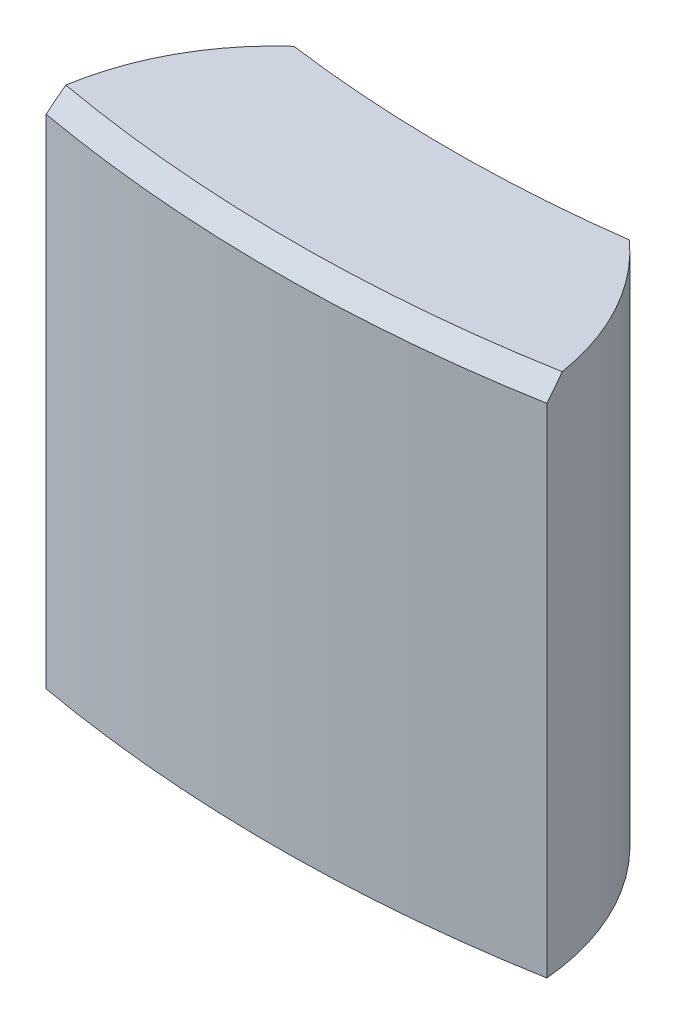
ISO-10303-21;
HEADER;
FILE_DESCRIPTION(('STEP AP214'),'2;1');
FILE_NAME('part.step','',(''),(''),'','','');
FILE_SCHEMA(('AUTOMOTIVE_DESIGN { 1 0 10303 214 1 1 1 1 }'));
ENDSEC;
DATA;
#1=APPLICATION_CONTEXT('core data for automotive mechanical design processes');
#2=APPLICATION_PROTOCOL_DEFINITION('international standard','automotive_design',2000,#1);
#3=PRODUCT_CONTEXT('',#1,'mechanical');
#4=PRODUCT('Part','Part','',(#3));
#5=PRODUCT_RELATED_PRODUCT_CATEGORY('part','',(#4));
#6=PRODUCT_DEFINITION_FORMATION('','',#4);
#7=PRODUCT_DEFINITION_CONTEXT('part definition',#1,'design');
#8=PRODUCT_DEFINITION('design','',#6,#7);
#9=PRODUCT_DEFINITION_SHAPE('','',#8);
#10=(LENGTH_UNIT() NAMED_UNIT(*) SI_UNIT(.MILLI.,.METRE.));
#11=(NAMED_UNIT(*) PLANE_ANGLE_UNIT() SI_UNIT($,.RADIAN.));
#12=(NAMED_UNIT(*) SI_UNIT($,.STERADIAN.) SOLID_ANGLE_UNIT());
#13=UNCERTAINTY_MEASURE_WITH_UNIT(LENGTH_MEASURE(1.E-05),#10,'distance_accuracy_value','');
#14=(GEOMETRIC_REPRESENTATION_CONTEXT(3) GLOBAL_UNCERTAINTY_ASSIGNED_CONTEXT((#13)) GLOBAL_UNIT_ASSIGNED_CONTEXT((#10,
#11,#12)) REPRESENTATION_CONTEXT('',''));
#15=CARTESIAN_POINT('',(0.,0.,0.));
#16=DIRECTION('',(0.,0.,1.));
#17=DIRECTION('',(1.,0.,0.));
#18=AXIS2_PLACEMENT_3D('',#15,#16,#17);
#19=CARTESIAN_POINT('',(0.,10.9,28.5));
#20=DIRECTION('',(0.,-1.,0.));
#21=DIRECTION('',(0.,0.,-1.));
#22=AXIS2_PLACEMENT_3D('',#19,#20,#21);
#23=CYLINDRICAL_SURFACE('',#22,5.00000000000001);
#24=CARTESIAN_POINT('',(0.,10.25,28.5));
#25=DIRECTION('',(0.,1.,0.));
#26=DIRECTION('',(0.,0.,1.));
#27=AXIS2_PLACEMENT_3D('',#24,#25,#26);
#28=CIRCLE('',#27,5.00000000000001);
#29=CARTESIAN_POINT('',(4.93776270558881,10.25,27.7135526315789));
#30=VERTEX_POINT('',#29);
#31=CARTESIAN_POINT('',(3.33679125812166,10.25,24.7763157894737));
#32=VERTEX_POINT('',#31);
#33=EDGE_CURVE('E86',#30,#32,#28,.T.);
#34=ORIENTED_EDGE('',*,*,#33,.F.);
#35=CARTESIAN_POINT('',(4.79380948915188,10.9,27.078947368421));
#36=CARTESIAN_POINT('',(4.84139794457398,10.7334348097428,27.2396663860205));
#37=CARTESIAN_POINT('',(4.88076856183125,10.5668188812858,27.4018972398446));
#38=CARTESIAN_POINT('',(4.94307412001981,10.2334855479525,27.7293826199612));
#39=CARTESIAN_POINT('',(4.96600906094916,10.0667681430762,27.8946371462541));
#40=CARTESIAN_POINT('',(4.98072616371173,9.89999999999999,28.0614035087719));
#41=B_SPLINE_CURVE_WITH_KNOTS('',3,(#35,#36,#37,#38,#39,#40),.UNSPECIFIED.,.F.,.F.,(4,2,4),(0.,
0.707578877201366,1.41515775448635),.UNSPECIFIED.);
#42=CARTESIAN_POINT('',(4.98072616371172,9.89999999999999,28.0614035087719));
#43=VERTEX_POINT('',#42);
#44=EDGE_CURVE('E94',#30,#43,#41,.T.);
#45=ORIENTED_EDGE('',*,*,#44,.T.);
#46=DIRECTION('',(0.,-1.,0.));
#47=VECTOR('',#46,1.);
#48=CARTESIAN_POINT('',(4.98072616371172,10.9,28.0614035087719));
#49=LINE('',#48,#47);
#50=CARTESIAN_POINT('',(4.98072616371172,0.,28.0614035087719));
#51=VERTEX_POINT('',#50);
#52=EDGE_CURVE('E134',#43,#51,#49,.T.);
#53=ORIENTED_EDGE('',*,*,#52,.T.);
#54=CARTESIAN_POINT('',(0.,0.,28.5));
#55=DIRECTION('',(0.,1.,0.));
#56=DIRECTION('',(0.,0.,1.));
#57=AXIS2_PLACEMENT_3D('',#54,#55,#56);
#58=CIRCLE('',#57,5.00000000000001);
#59=CARTESIAN_POINT('',(3.33679125812166,0.,24.7763157894737));
#60=VERTEX_POINT('',#59);
#61=EDGE_CURVE('E97',#51,#60,#58,.T.);
#62=ORIENTED_EDGE('',*,*,#61,.T.);
#63=DIRECTION('',(0.,-1.,0.));
#64=VECTOR('',#63,1.);
#65=CARTESIAN_POINT('',(3.33679125812166,10.9,24.7763157894737));
#66=LINE('',#65,#64);
#67=EDGE_CURVE('E96',#32,#60,#66,.T.);
#68=ORIENTED_EDGE('',*,*,#67,.F.);
#69=EDGE_LOOP('',(#34,#45,#53,#62,#68));
#70=FACE_BOUND('',#69,.T.);
#71=ADVANCED_FACE('F38',(#70),#23,.T.);
#72=CARTESIAN_POINT('',(0.,10.9,0.));
#73=DIRECTION('',(0.,-1.,0.));
#74=DIRECTION('',(0.,0.,-1.));
#75=AXIS2_PLACEMENT_3D('',#72,#73,#74);
#76=CYLINDRICAL_SURFACE('',#75,25.);
#77=CARTESIAN_POINT('',(0.,10.25,0.));
#78=DIRECTION('',(0.,1.,0.));
#79=DIRECTION('',(0.,0.,1.));
#80=AXIS2_PLACEMENT_3D('',#77,#78,#79);
#81=CIRCLE('',#80,25.);
#82=CARTESIAN_POINT('',(-3.33679125812165,10.25,24.7763157894737));
#83=VERTEX_POINT('',#82);
#84=EDGE_CURVE('E98',#32,#83,#81,.F.);
#85=ORIENTED_EDGE('',*,*,#84,.F.);
#86=ORIENTED_EDGE('',*,*,#67,.T.);
#87=CARTESIAN_POINT('',(0.,0.,0.));
#88=DIRECTION('',(0.,-1.,0.));
#89=DIRECTION('',(0.,0.,1.));
#90=AXIS2_PLACEMENT_3D('',#87,#88,#89);
#91=CIRCLE('',#90,25.);
#92=CARTESIAN_POINT('',(-3.33679125812165,0.,24.7763157894737));
#93=VERTEX_POINT('',#92);
#94=EDGE_CURVE('E141',#60,#93,#91,.T.);
#95=ORIENTED_EDGE('',*,*,#94,.T.);
#96=DIRECTION('',(0.,-1.,0.));
#97=VECTOR('',#96,1.);
#98=CARTESIAN_POINT('',(-3.33679125812165,10.9,24.7763157894737));
#99=LINE('',#98,#97);
#100=EDGE_CURVE('E102',#83,#93,#99,.T.);
#101=ORIENTED_EDGE('',*,*,#100,.F.);
#102=EDGE_LOOP('',(#85,#86,#95,#101));
#103=FACE_BOUND('',#102,.T.);
#104=ADVANCED_FACE('F112',(#103),#76,.F.);
#105=CARTESIAN_POINT('',(0.,10.9,28.5));
#106=DIRECTION('',(0.,-1.,0.));
#107=DIRECTION('',(0.,0.,-1.));
#108=AXIS2_PLACEMENT_3D('',#105,#106,#107);
#109=CYLINDRICAL_SURFACE('',#108,5.00000000000001);
#110=CARTESIAN_POINT('',(0.,10.25,28.5));
#111=DIRECTION('',(0.,1.,0.));
#112=DIRECTION('',(0.,0.,1.));
#113=AXIS2_PLACEMENT_3D('',#110,#111,#112);
#114=CIRCLE('',#113,5.00000000000001);
#115=CARTESIAN_POINT('',(-4.9377627055889,10.25,27.7135526315789));
#116=VERTEX_POINT('',#115);
#117=EDGE_CURVE('E55',#83,#116,#114,.T.);
#118=ORIENTED_EDGE('',*,*,#117,.F.);
#119=ORIENTED_EDGE('',*,*,#100,.T.);
#120=CARTESIAN_POINT('',(0.,0.,28.5));
#121=DIRECTION('',(0.,1.,0.));
#122=DIRECTION('',(0.,0.,1.));
#123=AXIS2_PLACEMENT_3D('',#120,#121,#122);
#124=CIRCLE('',#123,5.00000000000001);
#125=CARTESIAN_POINT('',(-4.98072616371173,0.,28.0614035087719));
#126=VERTEX_POINT('',#125);
#127=EDGE_CURVE('E131',#93,#126,#124,.T.);
#128=ORIENTED_EDGE('',*,*,#127,.T.);
#129=DIRECTION('',(0.,-1.,0.));
#130=VECTOR('',#129,1.);
#131=CARTESIAN_POINT('',(-4.98072616371173,10.9,28.0614035087719));
#132=LINE('',#131,#130);
#133=CARTESIAN_POINT('',(-4.98072616371173,9.89999999999999,28.0614035087719));
#134=VERTEX_POINT('',#133);
#135=EDGE_CURVE('E129',#134,#126,#132,.T.);
#136=ORIENTED_EDGE('',*,*,#135,.F.);
#137=CARTESIAN_POINT('',(-4.98072616371173,9.89999999999999,28.0614035087719));
#138=CARTESIAN_POINT('',(-4.96600906094916,10.0667681430762,27.8946371462541));
#139=CARTESIAN_POINT('',(-4.94307412001981,10.2334855479525,27.7293826199612));
#140=CARTESIAN_POINT('',(-4.88076856183125,10.5668188812858,27.4018972398446));
#141=CARTESIAN_POINT('',(-4.84139794457398,10.7334348097428,27.2396663860205));
#142=CARTESIAN_POINT('',(-4.79380948915188,10.9,27.078947368421));
#143=B_SPLINE_CURVE_WITH_KNOTS('',3,(#137,#138,#139,#140,#141,#142),.UNSPECIFIED.,.F.,.F.,(4,2,
4),(0.,0.707578877284988,1.41515775448636),.UNSPECIFIED.);
#144=EDGE_CURVE('E48',#134,#116,#143,.T.);
#145=ORIENTED_EDGE('',*,*,#144,.T.);
#146=EDGE_LOOP('',(#118,#119,#128,#136,#145));
#147=FACE_BOUND('',#146,.T.);
#148=ADVANCED_FACE('F115',(#147),#109,.T.);
#149=CARTESIAN_POINT('',(0.,10.9,0.));
#150=DIRECTION('',(0.,-1.,0.));
#151=DIRECTION('',(0.,0.,-1.));
#152=AXIS2_PLACEMENT_3D('',#149,#150,#151);
#153=CONICAL_SURFACE('',#152,27.5,0.785398163397443);
#154=ORIENTED_EDGE('',*,*,#44,.F.);
#155=CARTESIAN_POINT('',(0.,10.25,0.));
#156=DIRECTION('',(0.,1.,0.));
#157=DIRECTION('',(0.,0.,1.));
#158=AXIS2_PLACEMENT_3D('',#155,#156,#157);
#159=CIRCLE('',#158,28.15);
#160=EDGE_CURVE('E11',#30,#116,#159,.F.);
#161=ORIENTED_EDGE('',*,*,#160,.T.);
#162=ORIENTED_EDGE('',*,*,#144,.F.);
#163=CARTESIAN_POINT('',(0.,9.89999999999999,0.));
#164=DIRECTION('',(0.,1.,0.));
#165=DIRECTION('',(0.,0.,1.));
#166=AXIS2_PLACEMENT_3D('',#163,#164,#165);
#167=CIRCLE('',#166,28.5);
#168=EDGE_CURVE('E62',#43,#134,#167,.F.);
#169=ORIENTED_EDGE('',*,*,#168,.F.);
#170=EDGE_LOOP('',(#154,#161,#162,#169));
#171=FACE_BOUND('',#170,.T.);
#172=ADVANCED_FACE('F41',(#171),#153,.T.);
#173=CARTESIAN_POINT('',(0.,10.9,0.));
#174=DIRECTION('',(0.,-1.,0.));
#175=DIRECTION('',(0.,0.,-1.));
#176=AXIS2_PLACEMENT_3D('',#173,#174,#175);
#177=CYLINDRICAL_SURFACE('',#176,28.5);
#178=ORIENTED_EDGE('',*,*,#52,.F.);
#179=ORIENTED_EDGE('',*,*,#168,.T.);
#180=ORIENTED_EDGE('',*,*,#135,.T.);
#181=CARTESIAN_POINT('',(0.,0.,0.));
#182=DIRECTION('',(0.,1.,0.));
#183=DIRECTION('',(0.,0.,1.));
#184=AXIS2_PLACEMENT_3D('',#181,#182,#183);
#185=CIRCLE('',#184,28.5);
#186=EDGE_CURVE('E136',#126,#51,#185,.T.);
#187=ORIENTED_EDGE('',*,*,#186,.T.);
#188=EDGE_LOOP('',(#178,#179,#180,#187));
#189=FACE_BOUND('',#188,.T.);
#190=ADVANCED_FACE('F121',(#189),#177,.T.);
#191=CARTESIAN_POINT('',(0.,0.,14.25));
#192=DIRECTION('',(0.,1.,0.));
#193=DIRECTION('',(0.,0.,1.));
#194=AXIS2_PLACEMENT_3D('',#191,#192,#193);
#195=PLANE('',#194);
#196=ORIENTED_EDGE('',*,*,#61,.F.);
#197=ORIENTED_EDGE('',*,*,#186,.F.);
#198=ORIENTED_EDGE('',*,*,#127,.F.);
#199=ORIENTED_EDGE('',*,*,#94,.F.);
#200=EDGE_LOOP('',(#196,#197,#198,#199));
#201=FACE_BOUND('',#200,.T.);
#202=ADVANCED_FACE('F149',(#201),#195,.F.);
#203=CARTESIAN_POINT('',(0.,10.25,0.));
#204=DIRECTION('',(0.,1.,0.));
#205=DIRECTION('',(0.,0.,1.));
#206=AXIS2_PLACEMENT_3D('',#203,#204,#205);
#207=PLANE('',#206);
#208=ORIENTED_EDGE('',*,*,#33,.T.);
#209=ORIENTED_EDGE('',*,*,#84,.T.);
#210=ORIENTED_EDGE('',*,*,#117,.T.);
#211=ORIENTED_EDGE('',*,*,#160,.F.);
#212=EDGE_LOOP('',(#208,#209,#210,#211));
#213=FACE_BOUND('',#212,.T.);
#214=ADVANCED_FACE('F85',(#213),#207,.T.);
#215=CLOSED_SHELL('',(#71,#104,#148,#172,#190,#202,#214));
#216=MANIFOLD_SOLID_BREP('B2',#215);
#217=ADVANCED_BREP_SHAPE_REPRESENTATION('',(#18,#216),#14);
#218=SHAPE_DEFINITION_REPRESENTATION(#9,#217);
ENDSEC;
END-ISO-10303-21;
